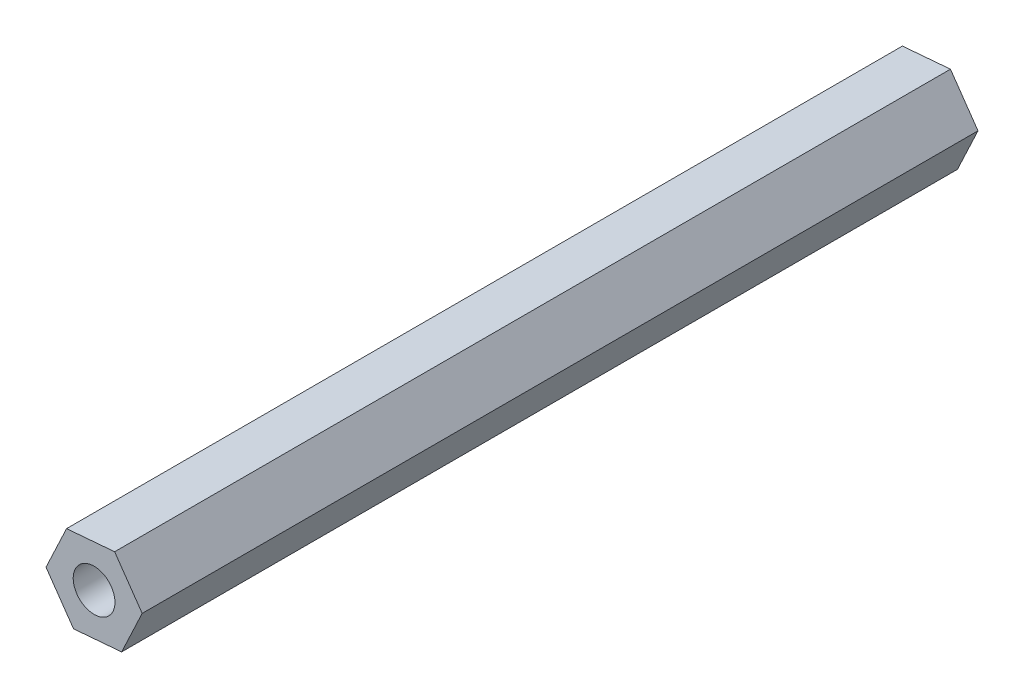
ISO-10303-21;
HEADER;
FILE_DESCRIPTION(('STEP AP214'),'2;1');
FILE_NAME('part.step','',(''),(''),'','','');
FILE_SCHEMA(('AUTOMOTIVE_DESIGN { 1 0 10303 214 1 1 1 1 }'));
ENDSEC;
DATA;
#1=APPLICATION_CONTEXT('core data for automotive mechanical design processes');
#2=APPLICATION_PROTOCOL_DEFINITION('international standard','automotive_design',2000,#1);
#3=PRODUCT_CONTEXT('',#1,'mechanical');
#4=PRODUCT('Part','Part','',(#3));
#5=PRODUCT_RELATED_PRODUCT_CATEGORY('part','',(#4));
#6=PRODUCT_DEFINITION_FORMATION('','',#4);
#7=PRODUCT_DEFINITION_CONTEXT('part definition',#1,'design');
#8=PRODUCT_DEFINITION('design','',#6,#7);
#9=PRODUCT_DEFINITION_SHAPE('','',#8);
#10=(LENGTH_UNIT() NAMED_UNIT(*) SI_UNIT(.MILLI.,.METRE.));
#11=(NAMED_UNIT(*) PLANE_ANGLE_UNIT() SI_UNIT($,.RADIAN.));
#12=(NAMED_UNIT(*) SI_UNIT($,.STERADIAN.) SOLID_ANGLE_UNIT());
#13=UNCERTAINTY_MEASURE_WITH_UNIT(LENGTH_MEASURE(1.E-05),#10,'distance_accuracy_value','');
#14=(GEOMETRIC_REPRESENTATION_CONTEXT(3) GLOBAL_UNCERTAINTY_ASSIGNED_CONTEXT((#13)) GLOBAL_UNIT_ASSIGNED_CONTEXT((#10,
#11,#12)) REPRESENTATION_CONTEXT('',''));
#15=CARTESIAN_POINT('',(0.,0.,0.));
#16=DIRECTION('',(0.,0.,1.));
#17=DIRECTION('',(1.,0.,0.));
#18=AXIS2_PLACEMENT_3D('',#15,#16,#17);
#19=CARTESIAN_POINT('',(0.209021377154071,-2.49124668868673,50.));
#20=DIRECTION('',(-0.0836085508616282,0.996498675474694,0.));
#21=DIRECTION('',(-0.996498675474694,-0.0836085508616282,0.));
#22=AXIS2_PLACEMENT_3D('',#19,#20,#21);
#23=PLANE('',#22);
#24=DIRECTION('',(0.996498675474694,0.0836085508616282,0.));
#25=VECTOR('',#24,1.);
#26=CARTESIAN_POINT('',(0.209021377154071,-2.49124668868673,0.));
#27=LINE('',#26,#25);
#28=CARTESIAN_POINT('',(-1.22930056917698,-2.61192523705302,0.));
#29=VERTEX_POINT('',#28);
#30=CARTESIAN_POINT('',(1.64734332348512,-2.37056814032044,0.));
#31=VERTEX_POINT('',#30);
#32=EDGE_CURVE('E148',#29,#31,#27,.T.);
#33=ORIENTED_EDGE('',*,*,#32,.T.);
#34=DIRECTION('',(0.,0.,-1.));
#35=VECTOR('',#34,1.);
#36=CARTESIAN_POINT('',(1.64734332348512,-2.37056814032044,50.));
#37=LINE('',#36,#35);
#38=CARTESIAN_POINT('',(1.64734332348512,-2.37056814032044,50.));
#39=VERTEX_POINT('',#38);
#40=EDGE_CURVE('E69',#39,#31,#37,.T.);
#41=ORIENTED_EDGE('',*,*,#40,.F.);
#42=DIRECTION('',(0.996498675474694,0.0836085508616282,0.));
#43=VECTOR('',#42,1.);
#44=CARTESIAN_POINT('',(0.209021377154071,-2.49124668868673,50.));
#45=LINE('',#44,#43);
#46=CARTESIAN_POINT('',(-1.22930056917698,-2.61192523705302,50.));
#47=VERTEX_POINT('',#46);
#48=EDGE_CURVE('E114',#47,#39,#45,.T.);
#49=ORIENTED_EDGE('',*,*,#48,.F.);
#50=DIRECTION('',(0.,0.,-1.));
#51=VECTOR('',#50,1.);
#52=CARTESIAN_POINT('',(-1.22930056917698,-2.61192523705302,50.));
#53=LINE('',#52,#51);
#54=EDGE_CURVE('E12',#47,#29,#53,.T.);
#55=ORIENTED_EDGE('',*,*,#54,.T.);
#56=EDGE_LOOP('',(#33,#41,#49,#55));
#57=FACE_BOUND('',#56,.T.);
#58=ADVANCED_FACE('F60',(#57),#23,.F.);
#59=CARTESIAN_POINT('',(2.26199360807361,-1.06460552179393,50.));
#60=DIRECTION('',(-0.904797443229444,0.425842208717574,0.));
#61=DIRECTION('',(-0.425842208717574,-0.904797443229444,0.));
#62=AXIS2_PLACEMENT_3D('',#59,#60,#61);
#63=PLANE('',#62);
#64=DIRECTION('',(0.425842208717574,0.904797443229444,0.));
#65=VECTOR('',#64,1.);
#66=CARTESIAN_POINT('',(2.26199360807361,-1.06460552179393,0.));
#67=LINE('',#66,#65);
#68=CARTESIAN_POINT('',(2.8766438926621,0.24135709673258,0.));
#69=VERTEX_POINT('',#68);
#70=EDGE_CURVE('E151',#31,#69,#67,.T.);
#71=ORIENTED_EDGE('',*,*,#70,.T.);
#72=DIRECTION('',(0.,0.,-1.));
#73=VECTOR('',#72,1.);
#74=CARTESIAN_POINT('',(2.8766438926621,0.24135709673258,50.));
#75=LINE('',#74,#73);
#76=CARTESIAN_POINT('',(2.8766438926621,0.24135709673258,50.));
#77=VERTEX_POINT('',#76);
#78=EDGE_CURVE('E136',#77,#69,#75,.T.);
#79=ORIENTED_EDGE('',*,*,#78,.F.);
#80=DIRECTION('',(0.425842208717574,0.904797443229444,0.));
#81=VECTOR('',#80,1.);
#82=CARTESIAN_POINT('',(2.26199360807361,-1.06460552179393,50.));
#83=LINE('',#82,#81);
#84=EDGE_CURVE('E127',#39,#77,#83,.T.);
#85=ORIENTED_EDGE('',*,*,#84,.F.);
#86=ORIENTED_EDGE('',*,*,#40,.T.);
#87=EDGE_LOOP('',(#71,#79,#85,#86));
#88=FACE_BOUND('',#87,.T.);
#89=ADVANCED_FACE('F162',(#88),#63,.F.);
#90=CARTESIAN_POINT('',(2.05297223091954,1.4266411668928,50.));
#91=DIRECTION('',(-0.821188892367816,-0.57065646675712,0.));
#92=DIRECTION('',(0.57065646675712,-0.821188892367816,0.));
#93=AXIS2_PLACEMENT_3D('',#90,#91,#92);
#94=PLANE('',#93);
#95=DIRECTION('',(-0.57065646675712,0.821188892367816,0.));
#96=VECTOR('',#95,1.);
#97=CARTESIAN_POINT('',(2.05297223091954,1.4266411668928,0.));
#98=LINE('',#97,#96);
#99=CARTESIAN_POINT('',(1.22930056917698,2.61192523705302,0.));
#100=VERTEX_POINT('',#99);
#101=EDGE_CURVE('E135',#69,#100,#98,.T.);
#102=ORIENTED_EDGE('',*,*,#101,.T.);
#103=DIRECTION('',(0.,0.,-1.));
#104=VECTOR('',#103,1.);
#105=CARTESIAN_POINT('',(1.22930056917698,2.61192523705302,50.));
#106=LINE('',#105,#104);
#107=CARTESIAN_POINT('',(1.22930056917698,2.61192523705302,50.));
#108=VERTEX_POINT('',#107);
#109=EDGE_CURVE('E132',#108,#100,#106,.T.);
#110=ORIENTED_EDGE('',*,*,#109,.F.);
#111=DIRECTION('',(-0.57065646675712,0.821188892367816,0.));
#112=VECTOR('',#111,1.);
#113=CARTESIAN_POINT('',(2.05297223091954,1.4266411668928,50.));
#114=LINE('',#113,#112);
#115=EDGE_CURVE('E121',#77,#108,#114,.T.);
#116=ORIENTED_EDGE('',*,*,#115,.F.);
#117=ORIENTED_EDGE('',*,*,#78,.T.);
#118=EDGE_LOOP('',(#102,#110,#116,#117));
#119=FACE_BOUND('',#118,.T.);
#120=ADVANCED_FACE('F133',(#119),#94,.F.);
#121=CARTESIAN_POINT('',(-0.20902137715407,2.49124668868673,50.));
#122=DIRECTION('',(0.083608550861628,-0.996498675474694,0.));
#123=DIRECTION('',(0.996498675474694,0.083608550861628,0.));
#124=AXIS2_PLACEMENT_3D('',#121,#122,#123);
#125=PLANE('',#124);
#126=DIRECTION('',(-0.996498675474694,-0.083608550861628,0.));
#127=VECTOR('',#126,1.);
#128=CARTESIAN_POINT('',(-0.20902137715407,2.49124668868673,0.));
#129=LINE('',#128,#127);
#130=CARTESIAN_POINT('',(-1.64734332348512,2.37056814032045,0.));
#131=VERTEX_POINT('',#130);
#132=EDGE_CURVE('E100',#100,#131,#129,.T.);
#133=ORIENTED_EDGE('',*,*,#132,.T.);
#134=DIRECTION('',(0.,0.,-1.));
#135=VECTOR('',#134,1.);
#136=CARTESIAN_POINT('',(-1.64734332348512,2.37056814032045,50.));
#137=LINE('',#136,#135);
#138=CARTESIAN_POINT('',(-1.64734332348512,2.37056814032045,50.));
#139=VERTEX_POINT('',#138);
#140=EDGE_CURVE('E137',#139,#131,#137,.T.);
#141=ORIENTED_EDGE('',*,*,#140,.F.);
#142=DIRECTION('',(-0.996498675474694,-0.083608550861628,0.));
#143=VECTOR('',#142,1.);
#144=CARTESIAN_POINT('',(-0.20902137715407,2.49124668868673,50.));
#145=LINE('',#144,#143);
#146=EDGE_CURVE('E125',#108,#139,#145,.T.);
#147=ORIENTED_EDGE('',*,*,#146,.F.);
#148=ORIENTED_EDGE('',*,*,#109,.T.);
#149=EDGE_LOOP('',(#133,#141,#147,#148));
#150=FACE_BOUND('',#149,.T.);
#151=ADVANCED_FACE('F139',(#150),#125,.F.);
#152=CARTESIAN_POINT('',(-2.26199360807361,1.06460552179393,50.));
#153=DIRECTION('',(0.904797443229444,-0.425842208717574,0.));
#154=DIRECTION('',(0.425842208717574,0.904797443229444,0.));
#155=AXIS2_PLACEMENT_3D('',#152,#153,#154);
#156=PLANE('',#155);
#157=DIRECTION('',(-0.425842208717574,-0.904797443229444,0.));
#158=VECTOR('',#157,1.);
#159=CARTESIAN_POINT('',(-2.26199360807361,1.06460552179393,0.));
#160=LINE('',#159,#158);
#161=CARTESIAN_POINT('',(-2.8766438926621,-0.241357096732576,0.));
#162=VERTEX_POINT('',#161);
#163=EDGE_CURVE('E106',#131,#162,#160,.T.);
#164=ORIENTED_EDGE('',*,*,#163,.T.);
#165=DIRECTION('',(0.,0.,-1.));
#166=VECTOR('',#165,1.);
#167=CARTESIAN_POINT('',(-2.8766438926621,-0.241357096732576,50.));
#168=LINE('',#167,#166);
#169=CARTESIAN_POINT('',(-2.8766438926621,-0.241357096732576,50.));
#170=VERTEX_POINT('',#169);
#171=EDGE_CURVE('E141',#170,#162,#168,.T.);
#172=ORIENTED_EDGE('',*,*,#171,.F.);
#173=DIRECTION('',(-0.425842208717574,-0.904797443229444,0.));
#174=VECTOR('',#173,1.);
#175=CARTESIAN_POINT('',(-2.26199360807361,1.06460552179393,50.));
#176=LINE('',#175,#174);
#177=EDGE_CURVE('E77',#139,#170,#176,.T.);
#178=ORIENTED_EDGE('',*,*,#177,.F.);
#179=ORIENTED_EDGE('',*,*,#140,.T.);
#180=EDGE_LOOP('',(#164,#172,#178,#179));
#181=FACE_BOUND('',#180,.T.);
#182=ADVANCED_FACE('F169',(#181),#156,.F.);
#183=CARTESIAN_POINT('',(-2.05297223091954,-1.4266411668928,50.));
#184=DIRECTION('',(0.821188892367816,0.570656466757119,0.));
#185=DIRECTION('',(-0.570656466757119,0.821188892367816,0.));
#186=AXIS2_PLACEMENT_3D('',#183,#184,#185);
#187=PLANE('',#186);
#188=DIRECTION('',(0.570656466757119,-0.821188892367816,0.));
#189=VECTOR('',#188,1.);
#190=CARTESIAN_POINT('',(-2.05297223091954,-1.4266411668928,0.));
#191=LINE('',#190,#189);
#192=EDGE_CURVE('E145',#162,#29,#191,.T.);
#193=ORIENTED_EDGE('',*,*,#192,.T.);
#194=ORIENTED_EDGE('',*,*,#54,.F.);
#195=DIRECTION('',(0.570656466757119,-0.821188892367816,0.));
#196=VECTOR('',#195,1.);
#197=CARTESIAN_POINT('',(-2.05297223091954,-1.4266411668928,50.));
#198=LINE('',#197,#196);
#199=EDGE_CURVE('E156',#170,#47,#198,.T.);
#200=ORIENTED_EDGE('',*,*,#199,.F.);
#201=ORIENTED_EDGE('',*,*,#171,.T.);
#202=EDGE_LOOP('',(#193,#194,#200,#201));
#203=FACE_BOUND('',#202,.T.);
#204=ADVANCED_FACE('F62',(#203),#187,.F.);
#205=CARTESIAN_POINT('',(0.,0.,0.));
#206=DIRECTION('',(0.,0.,1.));
#207=DIRECTION('',(1.,0.,0.));
#208=AXIS2_PLACEMENT_3D('',#205,#206,#207);
#209=PLANE('',#208);
#210=CARTESIAN_POINT('',(0.,0.,0.));
#211=DIRECTION('',(0.,0.,-1.));
#212=DIRECTION('',(-1.,0.,0.));
#213=AXIS2_PLACEMENT_3D('',#210,#211,#212);
#214=CIRCLE('',#213,1.24999999999999);
#215=CARTESIAN_POINT('',(-1.24999999999999,0.,0.));
#216=VERTEX_POINT('',#215);
#217=EDGE_CURVE('E241',#216,#216,#214,.T.);
#218=ORIENTED_EDGE('',*,*,#217,.F.);
#219=EDGE_LOOP('',(#218));
#220=FACE_BOUND('',#219,.T.);
#221=ORIENTED_EDGE('',*,*,#192,.F.);
#222=ORIENTED_EDGE('',*,*,#163,.F.);
#223=ORIENTED_EDGE('',*,*,#132,.F.);
#224=ORIENTED_EDGE('',*,*,#101,.F.);
#225=ORIENTED_EDGE('',*,*,#70,.F.);
#226=ORIENTED_EDGE('',*,*,#32,.F.);
#227=EDGE_LOOP('',(#221,#222,#223,#224,#225,#226));
#228=FACE_BOUND('',#227,.T.);
#229=ADVANCED_FACE('F165',(#220,#228),#209,.F.);
#230=CARTESIAN_POINT('',(0.,0.,50.));
#231=DIRECTION('',(0.,0.,1.));
#232=DIRECTION('',(1.,0.,0.));
#233=AXIS2_PLACEMENT_3D('',#230,#231,#232);
#234=PLANE('',#233);
#235=CARTESIAN_POINT('',(0.,0.,50.));
#236=DIRECTION('',(0.,0.,-1.));
#237=DIRECTION('',(-1.,0.,0.));
#238=AXIS2_PLACEMENT_3D('',#235,#236,#237);
#239=CIRCLE('',#238,1.24999999999999);
#240=CARTESIAN_POINT('',(-1.24999999999999,0.,50.));
#241=VERTEX_POINT('',#240);
#242=EDGE_CURVE('E149',#241,#241,#239,.T.);
#243=ORIENTED_EDGE('',*,*,#242,.T.);
#244=EDGE_LOOP('',(#243));
#245=FACE_BOUND('',#244,.T.);
#246=ORIENTED_EDGE('',*,*,#199,.T.);
#247=ORIENTED_EDGE('',*,*,#48,.T.);
#248=ORIENTED_EDGE('',*,*,#84,.T.);
#249=ORIENTED_EDGE('',*,*,#115,.T.);
#250=ORIENTED_EDGE('',*,*,#146,.T.);
#251=ORIENTED_EDGE('',*,*,#177,.T.);
#252=EDGE_LOOP('',(#246,#247,#248,#249,#250,#251));
#253=FACE_BOUND('',#252,.T.);
#254=ADVANCED_FACE('F123',(#245,#253),#234,.T.);
#255=CARTESIAN_POINT('',(0.,0.,0.));
#256=DIRECTION('',(0.,0.,-1.));
#257=DIRECTION('',(-1.,0.,0.));
#258=AXIS2_PLACEMENT_3D('',#255,#256,#257);
#259=CYLINDRICAL_SURFACE('',#258,1.24999999999999);
#260=ORIENTED_EDGE('',*,*,#242,.F.);
#261=EDGE_LOOP('',(#260));
#262=FACE_BOUND('',#261,.T.);
#263=ORIENTED_EDGE('',*,*,#217,.T.);
#264=EDGE_LOOP('',(#263));
#265=FACE_BOUND('',#264,.T.);
#266=ADVANCED_FACE('F220',(#262,#265),#259,.F.);
#267=CLOSED_SHELL('',(#58,#89,#120,#151,#182,#204,#229,#254,#266));
#268=MANIFOLD_SOLID_BREP('B2',#267);
#269=ADVANCED_BREP_SHAPE_REPRESENTATION('',(#18,#268),#14);
#270=SHAPE_DEFINITION_REPRESENTATION(#9,#269);
ENDSEC;
END-ISO-10303-21;
